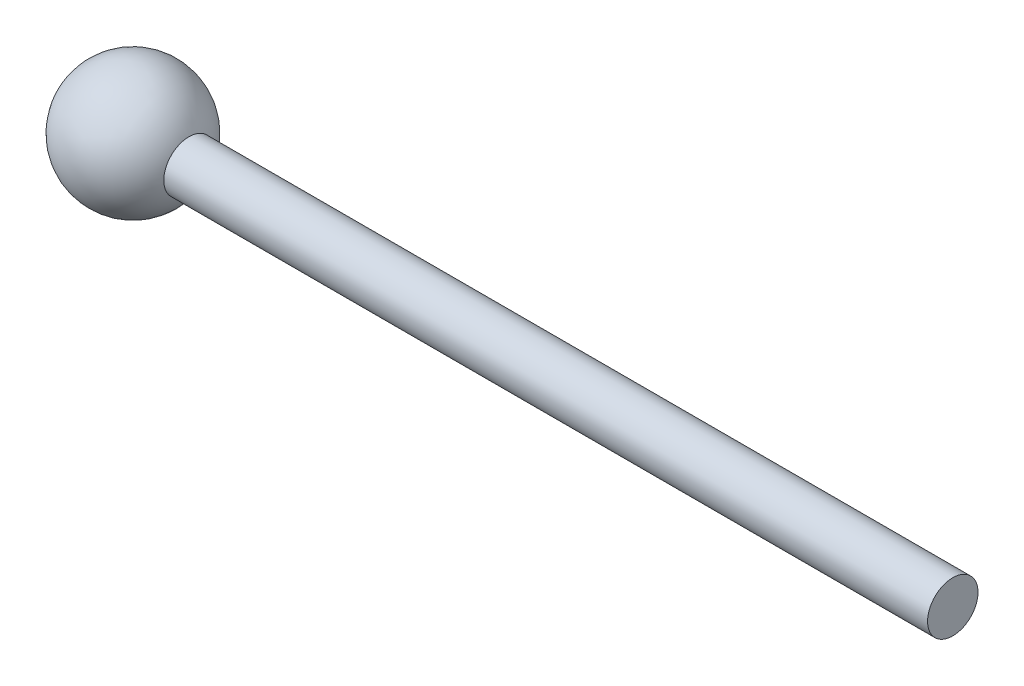
ISO-10303-21;
HEADER;
FILE_DESCRIPTION(('STEP AP214'),'2;1');
FILE_NAME('part.step','',(''),(''),'','','');
FILE_SCHEMA(('AUTOMOTIVE_DESIGN { 1 0 10303 214 1 1 1 1 }'));
ENDSEC;
DATA;
#1=APPLICATION_CONTEXT('core data for automotive mechanical design processes');
#2=APPLICATION_PROTOCOL_DEFINITION('international standard','automotive_design',2000,#1);
#3=PRODUCT_CONTEXT('',#1,'mechanical');
#4=PRODUCT('Part','Part','',(#3));
#5=PRODUCT_RELATED_PRODUCT_CATEGORY('part','',(#4));
#6=PRODUCT_DEFINITION_FORMATION('','',#4);
#7=PRODUCT_DEFINITION_CONTEXT('part definition',#1,'design');
#8=PRODUCT_DEFINITION('design','',#6,#7);
#9=PRODUCT_DEFINITION_SHAPE('','',#8);
#10=(LENGTH_UNIT() NAMED_UNIT(*) SI_UNIT(.MILLI.,.METRE.));
#11=(NAMED_UNIT(*) PLANE_ANGLE_UNIT() SI_UNIT($,.RADIAN.));
#12=(NAMED_UNIT(*) SI_UNIT($,.STERADIAN.) SOLID_ANGLE_UNIT());
#13=UNCERTAINTY_MEASURE_WITH_UNIT(LENGTH_MEASURE(1.E-05),#10,'distance_accuracy_value','');
#14=(GEOMETRIC_REPRESENTATION_CONTEXT(3) GLOBAL_UNCERTAINTY_ASSIGNED_CONTEXT((#13)) GLOBAL_UNIT_ASSIGNED_CONTEXT((#10,
#11,#12)) REPRESENTATION_CONTEXT('',''));
#15=CARTESIAN_POINT('',(0.,0.,0.));
#16=DIRECTION('',(0.,0.,1.));
#17=DIRECTION('',(1.,0.,0.));
#18=AXIS2_PLACEMENT_3D('',#15,#16,#17);
#19=CARTESIAN_POINT('',(68.5140192456752,0.,0.));
#20=DIRECTION('',(1.,0.,0.));
#21=DIRECTION('',(0.,-1.,0.));
#22=AXIS2_PLACEMENT_3D('',#19,#20,#21);
#23=SPHERICAL_SURFACE('',#22,9.75);
#24=CARTESIAN_POINT('',(77.4057288675645,0.,0.));
#25=DIRECTION('',(1.,0.,0.));
#26=DIRECTION('',(0.,1.,0.));
#27=AXIS2_PLACEMENT_3D('',#24,#25,#26);
#28=CIRCLE('',#27,4.);
#29=CARTESIAN_POINT('',(77.4057288675645,3.99999999999999,0.));
#30=VERTEX_POINT('',#29);
#31=EDGE_CURVE('E10',#30,#30,#28,.T.);
#32=ORIENTED_EDGE('',*,*,#31,.F.);
#33=EDGE_LOOP('',(#32));
#34=FACE_BOUND('',#33,.T.);
#35=ADVANCED_FACE('F30',(#34),#23,.T.);
#36=CARTESIAN_POINT('',(198.514019245675,0.,0.));
#37=DIRECTION('',(1.,0.,0.));
#38=DIRECTION('',(0.,1.,0.));
#39=AXIS2_PLACEMENT_3D('',#36,#37,#38);
#40=CYLINDRICAL_SURFACE('',#39,4.);
#41=CARTESIAN_POINT('',(198.514019245675,0.,0.));
#42=DIRECTION('',(1.,0.,0.));
#43=DIRECTION('',(0.,1.,0.));
#44=AXIS2_PLACEMENT_3D('',#41,#42,#43);
#45=CIRCLE('',#44,4.);
#46=CARTESIAN_POINT('',(198.514019245675,4.,0.));
#47=VERTEX_POINT('',#46);
#48=EDGE_CURVE('E36',#47,#47,#45,.T.);
#49=ORIENTED_EDGE('',*,*,#48,.F.);
#50=EDGE_LOOP('',(#49));
#51=FACE_BOUND('',#50,.T.);
#52=ORIENTED_EDGE('',*,*,#31,.T.);
#53=EDGE_LOOP('',(#52));
#54=FACE_BOUND('',#53,.T.);
#55=ADVANCED_FACE('F44',(#51,#54),#40,.T.);
#56=CARTESIAN_POINT('',(198.514019245675,0.,0.));
#57=DIRECTION('',(-1.,0.,0.));
#58=DIRECTION('',(0.,-1.,0.));
#59=AXIS2_PLACEMENT_3D('',#56,#57,#58);
#60=PLANE('',#59);
#61=ORIENTED_EDGE('',*,*,#48,.T.);
#62=EDGE_LOOP('',(#61));
#63=FACE_BOUND('',#62,.T.);
#64=ADVANCED_FACE('F42',(#63),#60,.F.);
#65=CLOSED_SHELL('',(#35,#55,#64));
#66=MANIFOLD_SOLID_BREP('B2',#65);
#67=ADVANCED_BREP_SHAPE_REPRESENTATION('',(#18,#66),#14);
#68=SHAPE_DEFINITION_REPRESENTATION(#9,#67);
ENDSEC;
END-ISO-10303-21;
